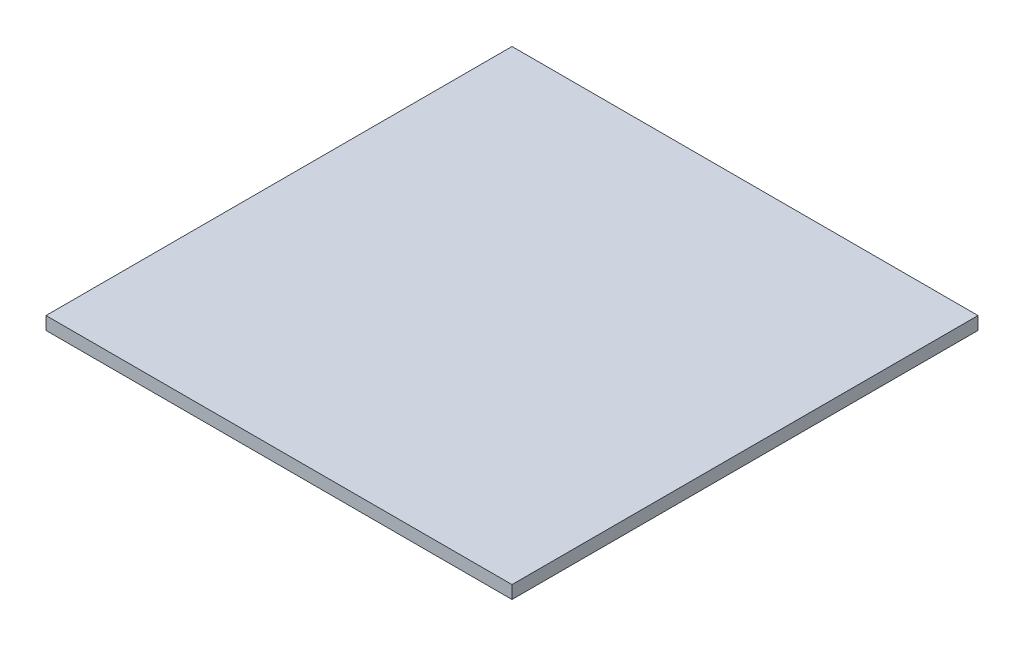
ISO-10303-21;
HEADER;
FILE_DESCRIPTION(('STEP AP214'),'2;1');
FILE_NAME('part.step','',(''),(''),'','','');
FILE_SCHEMA(('AUTOMOTIVE_DESIGN { 1 0 10303 214 1 1 1 1 }'));
ENDSEC;
DATA;
#1=APPLICATION_CONTEXT('core data for automotive mechanical design processes');
#2=APPLICATION_PROTOCOL_DEFINITION('international standard','automotive_design',2000,#1);
#3=PRODUCT_CONTEXT('',#1,'mechanical');
#4=PRODUCT('Part','Part','',(#3));
#5=PRODUCT_RELATED_PRODUCT_CATEGORY('part','',(#4));
#6=PRODUCT_DEFINITION_FORMATION('','',#4);
#7=PRODUCT_DEFINITION_CONTEXT('part definition',#1,'design');
#8=PRODUCT_DEFINITION('design','',#6,#7);
#9=PRODUCT_DEFINITION_SHAPE('','',#8);
#10=(LENGTH_UNIT() NAMED_UNIT(*) SI_UNIT(.MILLI.,.METRE.));
#11=(NAMED_UNIT(*) PLANE_ANGLE_UNIT() SI_UNIT($,.RADIAN.));
#12=(NAMED_UNIT(*) SI_UNIT($,.STERADIAN.) SOLID_ANGLE_UNIT());
#13=UNCERTAINTY_MEASURE_WITH_UNIT(LENGTH_MEASURE(1.E-05),#10,'distance_accuracy_value','');
#14=(GEOMETRIC_REPRESENTATION_CONTEXT(3) GLOBAL_UNCERTAINTY_ASSIGNED_CONTEXT((#13)) GLOBAL_UNIT_ASSIGNED_CONTEXT((#10,
#11,#12)) REPRESENTATION_CONTEXT('',''));
#15=CARTESIAN_POINT('',(0.,0.,0.));
#16=DIRECTION('',(0.,0.,1.));
#17=DIRECTION('',(1.,0.,0.));
#18=AXIS2_PLACEMENT_3D('',#15,#16,#17);
#19=CARTESIAN_POINT('',(228.6,12.7,228.6));
#20=DIRECTION('',(0.,0.,1.));
#21=DIRECTION('',(1.,0.,0.));
#22=AXIS2_PLACEMENT_3D('',#19,#20,#21);
#23=PLANE('',#22);
#24=DIRECTION('',(-1.,0.,0.));
#25=VECTOR('',#24,1.);
#26=CARTESIAN_POINT('',(228.6,0.,228.6));
#27=LINE('',#26,#25);
#28=CARTESIAN_POINT('',(228.6,0.,228.6));
#29=VERTEX_POINT('',#28);
#30=CARTESIAN_POINT('',(-228.6,0.,228.6));
#31=VERTEX_POINT('',#30);
#32=EDGE_CURVE('E98',#29,#31,#27,.T.);
#33=ORIENTED_EDGE('',*,*,#32,.F.);
#34=DIRECTION('',(0.,-1.,0.));
#35=VECTOR('',#34,1.);
#36=CARTESIAN_POINT('',(228.6,12.7,228.6));
#37=LINE('',#36,#35);
#38=CARTESIAN_POINT('',(228.6,12.7,228.6));
#39=VERTEX_POINT('',#38);
#40=EDGE_CURVE('E11',#39,#29,#37,.T.);
#41=ORIENTED_EDGE('',*,*,#40,.F.);
#42=DIRECTION('',(-1.,0.,0.));
#43=VECTOR('',#42,1.);
#44=CARTESIAN_POINT('',(228.6,12.7,228.6));
#45=LINE('',#44,#43);
#46=CARTESIAN_POINT('',(-228.6,12.7,228.6));
#47=VERTEX_POINT('',#46);
#48=EDGE_CURVE('E93',#39,#47,#45,.T.);
#49=ORIENTED_EDGE('',*,*,#48,.T.);
#50=DIRECTION('',(0.,-1.,0.));
#51=VECTOR('',#50,1.);
#52=CARTESIAN_POINT('',(-228.6,12.7,228.6));
#53=LINE('',#52,#51);
#54=EDGE_CURVE('E36',#47,#31,#53,.T.);
#55=ORIENTED_EDGE('',*,*,#54,.T.);
#56=EDGE_LOOP('',(#33,#41,#49,#55));
#57=FACE_BOUND('',#56,.T.);
#58=ADVANCED_FACE('F33',(#57),#23,.T.);
#59=CARTESIAN_POINT('',(228.6,12.7,228.6));
#60=DIRECTION('',(-1.,0.,0.));
#61=DIRECTION('',(0.,0.,1.));
#62=AXIS2_PLACEMENT_3D('',#59,#60,#61);
#63=PLANE('',#62);
#64=DIRECTION('',(0.,0.,-1.));
#65=VECTOR('',#64,1.);
#66=CARTESIAN_POINT('',(228.6,0.,228.6));
#67=LINE('',#66,#65);
#68=CARTESIAN_POINT('',(228.6,0.,-228.6));
#69=VERTEX_POINT('',#68);
#70=EDGE_CURVE('E66',#29,#69,#67,.T.);
#71=ORIENTED_EDGE('',*,*,#70,.T.);
#72=DIRECTION('',(0.,-1.,0.));
#73=VECTOR('',#72,1.);
#74=CARTESIAN_POINT('',(228.6,12.7,-228.6));
#75=LINE('',#74,#73);
#76=CARTESIAN_POINT('',(228.6,12.7,-228.6));
#77=VERTEX_POINT('',#76);
#78=EDGE_CURVE('E42',#77,#69,#75,.T.);
#79=ORIENTED_EDGE('',*,*,#78,.F.);
#80=DIRECTION('',(0.,0.,-1.));
#81=VECTOR('',#80,1.);
#82=CARTESIAN_POINT('',(228.6,12.7,228.6));
#83=LINE('',#82,#81);
#84=EDGE_CURVE('E83',#39,#77,#83,.T.);
#85=ORIENTED_EDGE('',*,*,#84,.F.);
#86=ORIENTED_EDGE('',*,*,#40,.T.);
#87=EDGE_LOOP('',(#71,#79,#85,#86));
#88=FACE_BOUND('',#87,.T.);
#89=ADVANCED_FACE('F108',(#88),#63,.F.);
#90=CARTESIAN_POINT('',(228.6,12.7,-228.6));
#91=DIRECTION('',(0.,0.,1.));
#92=DIRECTION('',(1.,0.,0.));
#93=AXIS2_PLACEMENT_3D('',#90,#91,#92);
#94=PLANE('',#93);
#95=DIRECTION('',(-1.,0.,0.));
#96=VECTOR('',#95,1.);
#97=CARTESIAN_POINT('',(228.6,0.,-228.6));
#98=LINE('',#97,#96);
#99=CARTESIAN_POINT('',(-228.6,0.,-228.6));
#100=VERTEX_POINT('',#99);
#101=EDGE_CURVE('E90',#69,#100,#98,.T.);
#102=ORIENTED_EDGE('',*,*,#101,.T.);
#103=DIRECTION('',(0.,-1.,0.));
#104=VECTOR('',#103,1.);
#105=CARTESIAN_POINT('',(-228.6,12.7,-228.6));
#106=LINE('',#105,#104);
#107=CARTESIAN_POINT('',(-228.6,12.7,-228.6));
#108=VERTEX_POINT('',#107);
#109=EDGE_CURVE('E87',#108,#100,#106,.T.);
#110=ORIENTED_EDGE('',*,*,#109,.F.);
#111=DIRECTION('',(-1.,0.,0.));
#112=VECTOR('',#111,1.);
#113=CARTESIAN_POINT('',(228.6,12.7,-228.6));
#114=LINE('',#113,#112);
#115=EDGE_CURVE('E78',#77,#108,#114,.T.);
#116=ORIENTED_EDGE('',*,*,#115,.F.);
#117=ORIENTED_EDGE('',*,*,#78,.T.);
#118=EDGE_LOOP('',(#102,#110,#116,#117));
#119=FACE_BOUND('',#118,.T.);
#120=ADVANCED_FACE('F88',(#119),#94,.F.);
#121=CARTESIAN_POINT('',(-228.6,12.7,228.6));
#122=DIRECTION('',(-1.,0.,0.));
#123=DIRECTION('',(0.,0.,1.));
#124=AXIS2_PLACEMENT_3D('',#121,#122,#123);
#125=PLANE('',#124);
#126=DIRECTION('',(0.,0.,-1.));
#127=VECTOR('',#126,1.);
#128=CARTESIAN_POINT('',(-228.6,0.,228.6));
#129=LINE('',#128,#127);
#130=EDGE_CURVE('E101',#31,#100,#129,.T.);
#131=ORIENTED_EDGE('',*,*,#130,.F.);
#132=ORIENTED_EDGE('',*,*,#54,.F.);
#133=DIRECTION('',(0.,0.,-1.));
#134=VECTOR('',#133,1.);
#135=CARTESIAN_POINT('',(-228.6,12.7,228.6));
#136=LINE('',#135,#134);
#137=EDGE_CURVE('E82',#47,#108,#136,.T.);
#138=ORIENTED_EDGE('',*,*,#137,.T.);
#139=ORIENTED_EDGE('',*,*,#109,.T.);
#140=EDGE_LOOP('',(#131,#132,#138,#139));
#141=FACE_BOUND('',#140,.T.);
#142=ADVANCED_FACE('F92',(#141),#125,.T.);
#143=CARTESIAN_POINT('',(0.,12.7,0.));
#144=DIRECTION('',(0.,-1.,0.));
#145=DIRECTION('',(0.,0.,-1.));
#146=AXIS2_PLACEMENT_3D('',#143,#144,#145);
#147=PLANE('',#146);
#148=ORIENTED_EDGE('',*,*,#48,.F.);
#149=ORIENTED_EDGE('',*,*,#84,.T.);
#150=ORIENTED_EDGE('',*,*,#115,.T.);
#151=ORIENTED_EDGE('',*,*,#137,.F.);
#152=EDGE_LOOP('',(#148,#149,#150,#151));
#153=FACE_BOUND('',#152,.T.);
#154=ADVANCED_FACE('F81',(#153),#147,.F.);
#155=CARTESIAN_POINT('',(0.,0.,0.));
#156=DIRECTION('',(0.,-1.,0.));
#157=DIRECTION('',(0.,0.,-1.));
#158=AXIS2_PLACEMENT_3D('',#155,#156,#157);
#159=PLANE('',#158);
#160=ORIENTED_EDGE('',*,*,#32,.T.);
#161=ORIENTED_EDGE('',*,*,#130,.T.);
#162=ORIENTED_EDGE('',*,*,#101,.F.);
#163=ORIENTED_EDGE('',*,*,#70,.F.);
#164=EDGE_LOOP('',(#160,#161,#162,#163));
#165=FACE_BOUND('',#164,.T.);
#166=ADVANCED_FACE('F106',(#165),#159,.T.);
#167=CLOSED_SHELL('',(#58,#89,#120,#142,#154,#166));
#168=MANIFOLD_SOLID_BREP('B2',#167);
#169=ADVANCED_BREP_SHAPE_REPRESENTATION('',(#18,#168),#14);
#170=SHAPE_DEFINITION_REPRESENTATION(#9,#169);
ENDSEC;
END-ISO-10303-21;
